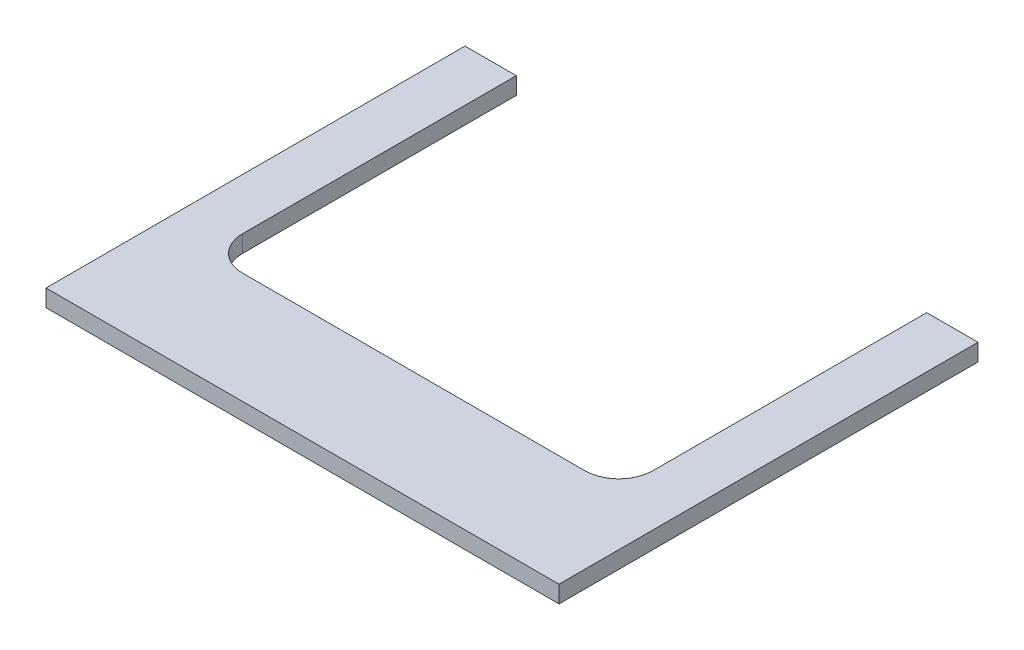
ISO-10303-21;
HEADER;
FILE_DESCRIPTION(('STEP AP214'),'2;1');
FILE_NAME('part.step','',(''),(''),'','','');
FILE_SCHEMA(('AUTOMOTIVE_DESIGN { 1 0 10303 214 1 1 1 1 }'));
ENDSEC;
DATA;
#1=APPLICATION_CONTEXT('core data for automotive mechanical design processes');
#2=APPLICATION_PROTOCOL_DEFINITION('international standard','automotive_design',2000,#1);
#3=PRODUCT_CONTEXT('',#1,'mechanical');
#4=PRODUCT('Part','Part','',(#3));
#5=PRODUCT_RELATED_PRODUCT_CATEGORY('part','',(#4));
#6=PRODUCT_DEFINITION_FORMATION('','',#4);
#7=PRODUCT_DEFINITION_CONTEXT('part definition',#1,'design');
#8=PRODUCT_DEFINITION('design','',#6,#7);
#9=PRODUCT_DEFINITION_SHAPE('','',#8);
#10=(LENGTH_UNIT() NAMED_UNIT(*) SI_UNIT(.MILLI.,.METRE.));
#11=(NAMED_UNIT(*) PLANE_ANGLE_UNIT() SI_UNIT($,.RADIAN.));
#12=(NAMED_UNIT(*) SI_UNIT($,.STERADIAN.) SOLID_ANGLE_UNIT());
#13=UNCERTAINTY_MEASURE_WITH_UNIT(LENGTH_MEASURE(1.E-05),#10,'distance_accuracy_value','');
#14=(GEOMETRIC_REPRESENTATION_CONTEXT(3) GLOBAL_UNCERTAINTY_ASSIGNED_CONTEXT((#13)) GLOBAL_UNIT_ASSIGNED_CONTEXT((#10,
#11,#12)) REPRESENTATION_CONTEXT('',''));
#15=CARTESIAN_POINT('',(0.,0.,0.));
#16=DIRECTION('',(0.,0.,1.));
#17=DIRECTION('',(1.,0.,0.));
#18=AXIS2_PLACEMENT_3D('',#15,#16,#17);
#19=CARTESIAN_POINT('',(150.,10.,-32.5));
#20=DIRECTION('',(-1.,0.,0.));
#21=DIRECTION('',(0.,0.,1.));
#22=AXIS2_PLACEMENT_3D('',#19,#20,#21);
#23=PLANE('',#22);
#24=DIRECTION('',(0.,0.,-1.));
#25=VECTOR('',#24,1.);
#26=CARTESIAN_POINT('',(150.,0.,-32.5));
#27=LINE('',#26,#25);
#28=CARTESIAN_POINT('',(150.,0.,32.5));
#29=VERTEX_POINT('',#28);
#30=CARTESIAN_POINT('',(150.,0.,-212.5));
#31=VERTEX_POINT('',#30);
#32=EDGE_CURVE('E125',#29,#31,#27,.T.);
#33=ORIENTED_EDGE('',*,*,#32,.T.);
#34=DIRECTION('',(0.,-1.,0.));
#35=VECTOR('',#34,1.);
#36=CARTESIAN_POINT('',(150.,10.,-212.5));
#37=LINE('',#36,#35);
#38=CARTESIAN_POINT('',(150.,10.,-212.5));
#39=VERTEX_POINT('',#38);
#40=EDGE_CURVE('E124',#39,#31,#37,.T.);
#41=ORIENTED_EDGE('',*,*,#40,.F.);
#42=DIRECTION('',(0.,0.,-1.));
#43=VECTOR('',#42,1.);
#44=CARTESIAN_POINT('',(150.,10.,-32.5));
#45=LINE('',#44,#43);
#46=CARTESIAN_POINT('',(150.,10.,32.5));
#47=VERTEX_POINT('',#46);
#48=EDGE_CURVE('E109',#47,#39,#45,.T.);
#49=ORIENTED_EDGE('',*,*,#48,.F.);
#50=DIRECTION('',(0.,-1.,0.));
#51=VECTOR('',#50,1.);
#52=CARTESIAN_POINT('',(150.,10.,32.5));
#53=LINE('',#52,#51);
#54=EDGE_CURVE('E147',#47,#29,#53,.T.);
#55=ORIENTED_EDGE('',*,*,#54,.T.);
#56=EDGE_LOOP('',(#33,#41,#49,#55));
#57=FACE_BOUND('',#56,.T.);
#58=ADVANCED_FACE('F35',(#57),#23,.F.);
#59=CARTESIAN_POINT('',(150.,10.,-212.5));
#60=DIRECTION('',(0.,0.,1.));
#61=DIRECTION('',(1.,0.,0.));
#62=AXIS2_PLACEMENT_3D('',#59,#60,#61);
#63=PLANE('',#62);
#64=DIRECTION('',(-1.,0.,0.));
#65=VECTOR('',#64,1.);
#66=CARTESIAN_POINT('',(150.,0.,-212.5));
#67=LINE('',#66,#65);
#68=CARTESIAN_POINT('',(120.,0.,-212.5));
#69=VERTEX_POINT('',#68);
#70=EDGE_CURVE('E149',#31,#69,#67,.T.);
#71=ORIENTED_EDGE('',*,*,#70,.T.);
#72=DIRECTION('',(0.,-1.,0.));
#73=VECTOR('',#72,1.);
#74=CARTESIAN_POINT('',(120.,10.,-212.5));
#75=LINE('',#74,#73);
#76=CARTESIAN_POINT('',(120.,10.,-212.5));
#77=VERTEX_POINT('',#76);
#78=EDGE_CURVE('E129',#77,#69,#75,.T.);
#79=ORIENTED_EDGE('',*,*,#78,.F.);
#80=DIRECTION('',(-1.,0.,0.));
#81=VECTOR('',#80,1.);
#82=CARTESIAN_POINT('',(150.,10.,-212.5));
#83=LINE('',#82,#81);
#84=EDGE_CURVE('E114',#39,#77,#83,.T.);
#85=ORIENTED_EDGE('',*,*,#84,.F.);
#86=ORIENTED_EDGE('',*,*,#40,.T.);
#87=EDGE_LOOP('',(#71,#79,#85,#86));
#88=FACE_BOUND('',#87,.T.);
#89=ADVANCED_FACE('F131',(#88),#63,.F.);
#90=CARTESIAN_POINT('',(120.,10.,-32.5));
#91=DIRECTION('',(1.,0.,0.));
#92=DIRECTION('',(0.,0.,-1.));
#93=AXIS2_PLACEMENT_3D('',#90,#91,#92);
#94=PLANE('',#93);
#95=DIRECTION('',(0.,0.,1.));
#96=VECTOR('',#95,1.);
#97=CARTESIAN_POINT('',(120.,0.,-32.5));
#98=LINE('',#97,#96);
#99=CARTESIAN_POINT('',(120.,0.,-52.5));
#100=VERTEX_POINT('',#99);
#101=EDGE_CURVE('E151',#69,#100,#98,.T.);
#102=ORIENTED_EDGE('',*,*,#101,.T.);
#103=DIRECTION('',(0.,-1.,0.));
#104=VECTOR('',#103,1.);
#105=CARTESIAN_POINT('',(120.,10.,-52.5));
#106=LINE('',#105,#104);
#107=CARTESIAN_POINT('',(120.,10.,-52.5));
#108=VERTEX_POINT('',#107);
#109=EDGE_CURVE('E181',#100,#108,#106,.F.);
#110=ORIENTED_EDGE('',*,*,#109,.T.);
#111=DIRECTION('',(0.,0.,1.));
#112=VECTOR('',#111,1.);
#113=CARTESIAN_POINT('',(120.,10.,-32.5));
#114=LINE('',#113,#112);
#115=EDGE_CURVE('E134',#77,#108,#114,.T.);
#116=ORIENTED_EDGE('',*,*,#115,.F.);
#117=ORIENTED_EDGE('',*,*,#78,.T.);
#118=EDGE_LOOP('',(#102,#110,#116,#117));
#119=FACE_BOUND('',#118,.T.);
#120=ADVANCED_FACE('F213',(#119),#94,.F.);
#121=CARTESIAN_POINT('',(-120.,10.,-32.5));
#122=DIRECTION('',(0.,0.,1.));
#123=DIRECTION('',(1.,0.,0.));
#124=AXIS2_PLACEMENT_3D('',#121,#122,#123);
#125=PLANE('',#124);
#126=DIRECTION('',(-1.,0.,0.));
#127=VECTOR('',#126,1.);
#128=CARTESIAN_POINT('',(-120.,10.,-32.5));
#129=LINE('',#128,#127);
#130=CARTESIAN_POINT('',(100.,10.,-32.5));
#131=VERTEX_POINT('',#130);
#132=CARTESIAN_POINT('',(-100.,10.,-32.5));
#133=VERTEX_POINT('',#132);
#134=EDGE_CURVE('E136',#131,#133,#129,.T.);
#135=ORIENTED_EDGE('',*,*,#134,.F.);
#136=DIRECTION('',(0.,-1.,0.));
#137=VECTOR('',#136,1.);
#138=CARTESIAN_POINT('',(100.,0.,-32.5));
#139=LINE('',#138,#137);
#140=CARTESIAN_POINT('',(100.,0.,-32.5));
#141=VERTEX_POINT('',#140);
#142=EDGE_CURVE('E178',#131,#141,#139,.T.);
#143=ORIENTED_EDGE('',*,*,#142,.T.);
#144=DIRECTION('',(-1.,0.,0.));
#145=VECTOR('',#144,1.);
#146=CARTESIAN_POINT('',(-120.,0.,-32.5));
#147=LINE('',#146,#145);
#148=CARTESIAN_POINT('',(-100.,0.,-32.5));
#149=VERTEX_POINT('',#148);
#150=EDGE_CURVE('E154',#141,#149,#147,.T.);
#151=ORIENTED_EDGE('',*,*,#150,.T.);
#152=DIRECTION('',(0.,-1.,0.));
#153=VECTOR('',#152,1.);
#154=CARTESIAN_POINT('',(-100.,10.,-32.5));
#155=LINE('',#154,#153);
#156=EDGE_CURVE('E128',#149,#133,#155,.F.);
#157=ORIENTED_EDGE('',*,*,#156,.T.);
#158=EDGE_LOOP('',(#135,#143,#151,#157));
#159=FACE_BOUND('',#158,.T.);
#160=ADVANCED_FACE('F195',(#159),#125,.F.);
#161=CARTESIAN_POINT('',(-120.,10.,-212.5));
#162=DIRECTION('',(-1.,0.,0.));
#163=DIRECTION('',(0.,0.,1.));
#164=AXIS2_PLACEMENT_3D('',#161,#162,#163);
#165=PLANE('',#164);
#166=DIRECTION('',(0.,0.,-1.));
#167=VECTOR('',#166,1.);
#168=CARTESIAN_POINT('',(-120.,10.,-212.5));
#169=LINE('',#168,#167);
#170=CARTESIAN_POINT('',(-120.,10.,-52.5000000000001));
#171=VERTEX_POINT('',#170);
#172=CARTESIAN_POINT('',(-120.,10.,-212.5));
#173=VERTEX_POINT('',#172);
#174=EDGE_CURVE('E140',#171,#173,#169,.T.);
#175=ORIENTED_EDGE('',*,*,#174,.F.);
#176=DIRECTION('',(0.,-1.,0.));
#177=VECTOR('',#176,1.);
#178=CARTESIAN_POINT('',(-120.,0.,-52.5));
#179=LINE('',#178,#177);
#180=CARTESIAN_POINT('',(-120.,0.,-52.5000000000001));
#181=VERTEX_POINT('',#180);
#182=EDGE_CURVE('E183',#171,#181,#179,.T.);
#183=ORIENTED_EDGE('',*,*,#182,.T.);
#184=DIRECTION('',(0.,0.,-1.));
#185=VECTOR('',#184,1.);
#186=CARTESIAN_POINT('',(-120.,0.,-212.5));
#187=LINE('',#186,#185);
#188=CARTESIAN_POINT('',(-120.,0.,-212.5));
#189=VERTEX_POINT('',#188);
#190=EDGE_CURVE('E157',#181,#189,#187,.T.);
#191=ORIENTED_EDGE('',*,*,#190,.T.);
#192=DIRECTION('',(0.,-1.,0.));
#193=VECTOR('',#192,1.);
#194=CARTESIAN_POINT('',(-120.,10.,-212.5));
#195=LINE('',#194,#193);
#196=EDGE_CURVE('E173',#173,#189,#195,.T.);
#197=ORIENTED_EDGE('',*,*,#196,.F.);
#198=EDGE_LOOP('',(#175,#183,#191,#197));
#199=FACE_BOUND('',#198,.T.);
#200=ADVANCED_FACE('F198',(#199),#165,.F.);
#201=CARTESIAN_POINT('',(-150.,10.,-212.5));
#202=DIRECTION('',(0.,0.,1.));
#203=DIRECTION('',(1.,0.,0.));
#204=AXIS2_PLACEMENT_3D('',#201,#202,#203);
#205=PLANE('',#204);
#206=DIRECTION('',(-1.,0.,0.));
#207=VECTOR('',#206,1.);
#208=CARTESIAN_POINT('',(-150.,0.,-212.5));
#209=LINE('',#208,#207);
#210=CARTESIAN_POINT('',(-150.,0.,-212.5));
#211=VERTEX_POINT('',#210);
#212=EDGE_CURVE('E159',#189,#211,#209,.T.);
#213=ORIENTED_EDGE('',*,*,#212,.T.);
#214=DIRECTION('',(0.,-1.,0.));
#215=VECTOR('',#214,1.);
#216=CARTESIAN_POINT('',(-150.,10.,-212.5));
#217=LINE('',#216,#215);
#218=CARTESIAN_POINT('',(-150.,10.,-212.5));
#219=VERTEX_POINT('',#218);
#220=EDGE_CURVE('E170',#219,#211,#217,.T.);
#221=ORIENTED_EDGE('',*,*,#220,.F.);
#222=DIRECTION('',(-1.,0.,0.));
#223=VECTOR('',#222,1.);
#224=CARTESIAN_POINT('',(-150.,10.,-212.5));
#225=LINE('',#224,#223);
#226=EDGE_CURVE('E142',#173,#219,#225,.T.);
#227=ORIENTED_EDGE('',*,*,#226,.F.);
#228=ORIENTED_EDGE('',*,*,#196,.T.);
#229=EDGE_LOOP('',(#213,#221,#227,#228));
#230=FACE_BOUND('',#229,.T.);
#231=ADVANCED_FACE('F205',(#230),#205,.F.);
#232=CARTESIAN_POINT('',(-150.,10.,-32.5));
#233=DIRECTION('',(1.,0.,0.));
#234=DIRECTION('',(0.,0.,-1.));
#235=AXIS2_PLACEMENT_3D('',#232,#233,#234);
#236=PLANE('',#235);
#237=DIRECTION('',(0.,0.,1.));
#238=VECTOR('',#237,1.);
#239=CARTESIAN_POINT('',(-150.,0.,-32.5));
#240=LINE('',#239,#238);
#241=CARTESIAN_POINT('',(-150.,0.,32.5));
#242=VERTEX_POINT('',#241);
#243=EDGE_CURVE('E162',#211,#242,#240,.T.);
#244=ORIENTED_EDGE('',*,*,#243,.T.);
#245=DIRECTION('',(0.,-1.,0.));
#246=VECTOR('',#245,1.);
#247=CARTESIAN_POINT('',(-150.,10.,32.5));
#248=LINE('',#247,#246);
#249=CARTESIAN_POINT('',(-150.,10.,32.5));
#250=VERTEX_POINT('',#249);
#251=EDGE_CURVE('E167',#250,#242,#248,.T.);
#252=ORIENTED_EDGE('',*,*,#251,.F.);
#253=DIRECTION('',(0.,0.,1.));
#254=VECTOR('',#253,1.);
#255=CARTESIAN_POINT('',(-150.,10.,-212.5));
#256=LINE('',#255,#254);
#257=EDGE_CURVE('E144',#219,#250,#256,.T.);
#258=ORIENTED_EDGE('',*,*,#257,.F.);
#259=ORIENTED_EDGE('',*,*,#220,.T.);
#260=EDGE_LOOP('',(#244,#252,#258,#259));
#261=FACE_BOUND('',#260,.T.);
#262=ADVANCED_FACE('F207',(#261),#236,.F.);
#263=CARTESIAN_POINT('',(-150.,10.,32.5));
#264=DIRECTION('',(0.,0.,-1.));
#265=DIRECTION('',(-1.,0.,0.));
#266=AXIS2_PLACEMENT_3D('',#263,#264,#265);
#267=PLANE('',#266);
#268=DIRECTION('',(1.,0.,0.));
#269=VECTOR('',#268,1.);
#270=CARTESIAN_POINT('',(-150.,0.,32.5));
#271=LINE('',#270,#269);
#272=EDGE_CURVE('E121',#242,#29,#271,.T.);
#273=ORIENTED_EDGE('',*,*,#272,.T.);
#274=ORIENTED_EDGE('',*,*,#54,.F.);
#275=DIRECTION('',(1.,0.,0.));
#276=VECTOR('',#275,1.);
#277=CARTESIAN_POINT('',(-150.,10.,32.5));
#278=LINE('',#277,#276);
#279=EDGE_CURVE('E117',#250,#47,#278,.T.);
#280=ORIENTED_EDGE('',*,*,#279,.F.);
#281=ORIENTED_EDGE('',*,*,#251,.T.);
#282=EDGE_LOOP('',(#273,#274,#280,#281));
#283=FACE_BOUND('',#282,.T.);
#284=ADVANCED_FACE('F210',(#283),#267,.F.);
#285=CARTESIAN_POINT('',(0.,10.,0.));
#286=DIRECTION('',(0.,1.,0.));
#287=DIRECTION('',(0.,0.,1.));
#288=AXIS2_PLACEMENT_3D('',#285,#286,#287);
#289=PLANE('',#288);
#290=ORIENTED_EDGE('',*,*,#48,.T.);
#291=ORIENTED_EDGE('',*,*,#84,.T.);
#292=ORIENTED_EDGE('',*,*,#115,.T.);
#293=CARTESIAN_POINT('',(100.,10.,-52.5));
#294=DIRECTION('',(0.,1.,0.));
#295=DIRECTION('',(0.,0.,1.));
#296=AXIS2_PLACEMENT_3D('',#293,#294,#295);
#297=CIRCLE('',#296,20.);
#298=EDGE_CURVE('E187',#108,#131,#297,.F.);
#299=ORIENTED_EDGE('',*,*,#298,.T.);
#300=ORIENTED_EDGE('',*,*,#134,.T.);
#301=CARTESIAN_POINT('',(-100.,10.,-52.5));
#302=DIRECTION('',(0.,1.,0.));
#303=DIRECTION('',(0.,0.,1.));
#304=AXIS2_PLACEMENT_3D('',#301,#302,#303);
#305=CIRCLE('',#304,20.);
#306=EDGE_CURVE('E11',#133,#171,#305,.F.);
#307=ORIENTED_EDGE('',*,*,#306,.T.);
#308=ORIENTED_EDGE('',*,*,#174,.T.);
#309=ORIENTED_EDGE('',*,*,#226,.T.);
#310=ORIENTED_EDGE('',*,*,#257,.T.);
#311=ORIENTED_EDGE('',*,*,#279,.T.);
#312=EDGE_LOOP('',(#290,#291,#292,#299,#300,#307,#308,#309,#310,#311));
#313=FACE_BOUND('',#312,.T.);
#314=ADVANCED_FACE('F111',(#313),#289,.T.);
#315=CARTESIAN_POINT('',(0.,0.,0.));
#316=DIRECTION('',(0.,1.,0.));
#317=DIRECTION('',(0.,0.,1.));
#318=AXIS2_PLACEMENT_3D('',#315,#316,#317);
#319=PLANE('',#318);
#320=ORIENTED_EDGE('',*,*,#32,.F.);
#321=ORIENTED_EDGE('',*,*,#272,.F.);
#322=ORIENTED_EDGE('',*,*,#243,.F.);
#323=ORIENTED_EDGE('',*,*,#212,.F.);
#324=ORIENTED_EDGE('',*,*,#190,.F.);
#325=CARTESIAN_POINT('',(-100.,0.,-52.5));
#326=DIRECTION('',(0.,1.,0.));
#327=DIRECTION('',(0.,0.,1.));
#328=AXIS2_PLACEMENT_3D('',#325,#326,#327);
#329=CIRCLE('',#328,20.);
#330=EDGE_CURVE('E43',#181,#149,#329,.T.);
#331=ORIENTED_EDGE('',*,*,#330,.T.);
#332=ORIENTED_EDGE('',*,*,#150,.F.);
#333=CARTESIAN_POINT('',(100.,0.,-52.5));
#334=DIRECTION('',(0.,1.,0.));
#335=DIRECTION('',(0.,0.,1.));
#336=AXIS2_PLACEMENT_3D('',#333,#334,#335);
#337=CIRCLE('',#336,20.);
#338=EDGE_CURVE('E185',#141,#100,#337,.T.);
#339=ORIENTED_EDGE('',*,*,#338,.T.);
#340=ORIENTED_EDGE('',*,*,#101,.F.);
#341=ORIENTED_EDGE('',*,*,#70,.F.);
#342=EDGE_LOOP('',(#320,#321,#322,#323,#324,#331,#332,#339,#340,#341));
#343=FACE_BOUND('',#342,.T.);
#344=ADVANCED_FACE('F191',(#343),#319,.F.);
#345=CARTESIAN_POINT('',(100.,10.,-52.5));
#346=DIRECTION('',(0.,1.,0.));
#347=DIRECTION('',(0.,0.,1.));
#348=AXIS2_PLACEMENT_3D('',#345,#346,#347);
#349=CYLINDRICAL_SURFACE('',#348,20.);
#350=ORIENTED_EDGE('',*,*,#298,.F.);
#351=ORIENTED_EDGE('',*,*,#109,.F.);
#352=ORIENTED_EDGE('',*,*,#338,.F.);
#353=ORIENTED_EDGE('',*,*,#142,.F.);
#354=EDGE_LOOP('',(#350,#351,#352,#353));
#355=FACE_BOUND('',#354,.T.);
#356=ADVANCED_FACE('F217',(#355),#349,.F.);
#357=CARTESIAN_POINT('',(-100.,10.,-52.5));
#358=DIRECTION('',(0.,1.,0.));
#359=DIRECTION('',(0.,0.,1.));
#360=AXIS2_PLACEMENT_3D('',#357,#358,#359);
#361=CYLINDRICAL_SURFACE('',#360,20.);
#362=ORIENTED_EDGE('',*,*,#306,.F.);
#363=ORIENTED_EDGE('',*,*,#156,.F.);
#364=ORIENTED_EDGE('',*,*,#330,.F.);
#365=ORIENTED_EDGE('',*,*,#182,.F.);
#366=EDGE_LOOP('',(#362,#363,#364,#365));
#367=FACE_BOUND('',#366,.T.);
#368=ADVANCED_FACE('F37',(#367),#361,.F.);
#369=CLOSED_SHELL('',(#58,#89,#120,#160,#200,#231,#262,#284,#314,#344,#356,#368));
#370=MANIFOLD_SOLID_BREP('B2',#369);
#371=ADVANCED_BREP_SHAPE_REPRESENTATION('',(#18,#370),#14);
#372=SHAPE_DEFINITION_REPRESENTATION(#9,#371);
ENDSEC;
END-ISO-10303-21;
